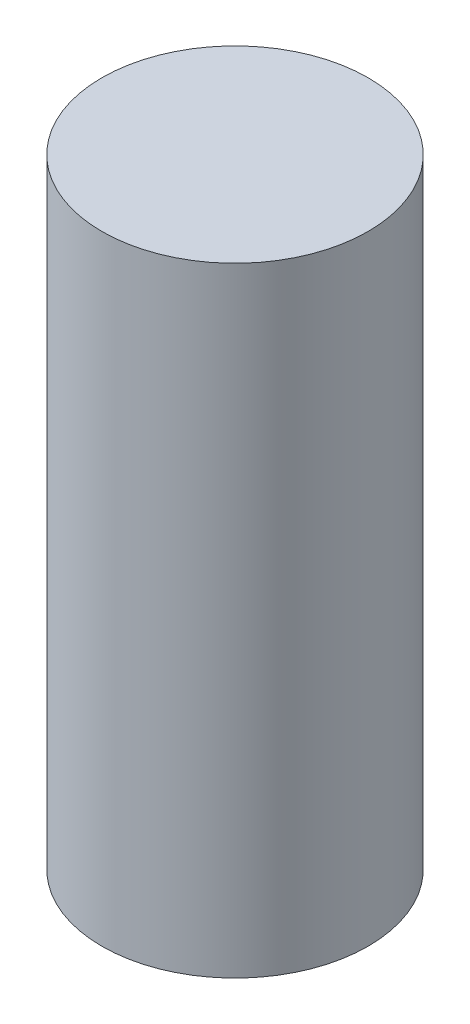
ISO-10303-21;
HEADER;
FILE_DESCRIPTION(('STEP AP214'),'2;1');
FILE_NAME('part.step','',(''),(''),'','','');
FILE_SCHEMA(('AUTOMOTIVE_DESIGN { 1 0 10303 214 1 1 1 1 }'));
ENDSEC;
DATA;
#1=APPLICATION_CONTEXT('core data for automotive mechanical design processes');
#2=APPLICATION_PROTOCOL_DEFINITION('international standard','automotive_design',2000,#1);
#3=PRODUCT_CONTEXT('',#1,'mechanical');
#4=PRODUCT('Part','Part','',(#3));
#5=PRODUCT_RELATED_PRODUCT_CATEGORY('part','',(#4));
#6=PRODUCT_DEFINITION_FORMATION('','',#4);
#7=PRODUCT_DEFINITION_CONTEXT('part definition',#1,'design');
#8=PRODUCT_DEFINITION('design','',#6,#7);
#9=PRODUCT_DEFINITION_SHAPE('','',#8);
#10=(LENGTH_UNIT() NAMED_UNIT(*) SI_UNIT(.MILLI.,.METRE.));
#11=(NAMED_UNIT(*) PLANE_ANGLE_UNIT() SI_UNIT($,.RADIAN.));
#12=(NAMED_UNIT(*) SI_UNIT($,.STERADIAN.) SOLID_ANGLE_UNIT());
#13=UNCERTAINTY_MEASURE_WITH_UNIT(LENGTH_MEASURE(1.E-05),#10,'distance_accuracy_value','');
#14=(GEOMETRIC_REPRESENTATION_CONTEXT(3) GLOBAL_UNCERTAINTY_ASSIGNED_CONTEXT((#13)) GLOBAL_UNIT_ASSIGNED_CONTEXT((#10,
#11,#12)) REPRESENTATION_CONTEXT('',''));
#15=CARTESIAN_POINT('',(0.,0.,0.));
#16=DIRECTION('',(0.,0.,1.));
#17=DIRECTION('',(1.,0.,0.));
#18=AXIS2_PLACEMENT_3D('',#15,#16,#17);
#19=CARTESIAN_POINT('',(-13.4853615461327,150.,-9.78349759229237));
#20=DIRECTION('',(0.,-1.,0.));
#21=DIRECTION('',(0.,0.,-1.));
#22=AXIS2_PLACEMENT_3D('',#19,#20,#21);
#23=CYLINDRICAL_SURFACE('',#22,32.2591001691802);
#24=CARTESIAN_POINT('',(-13.4853615461327,150.,-9.78349759229237));
#25=DIRECTION('',(0.,1.,0.));
#26=DIRECTION('',(0.,0.,1.));
#27=AXIS2_PLACEMENT_3D('',#24,#25,#26);
#28=CIRCLE('',#27,32.2591001691802);
#29=CARTESIAN_POINT('',(-13.4853615461327,150.,22.4756025768878));
#30=VERTEX_POINT('',#29);
#31=EDGE_CURVE('E10',#30,#30,#28,.T.);
#32=ORIENTED_EDGE('',*,*,#31,.F.);
#33=EDGE_LOOP('',(#32));
#34=FACE_BOUND('',#33,.T.);
#35=CARTESIAN_POINT('',(-13.4853615461327,0.,-9.78349759229237));
#36=DIRECTION('',(0.,1.,0.));
#37=DIRECTION('',(0.,0.,1.));
#38=AXIS2_PLACEMENT_3D('',#35,#36,#37);
#39=CIRCLE('',#38,32.2591001691802);
#40=CARTESIAN_POINT('',(-13.4853615461327,0.,22.4756025768878));
#41=VERTEX_POINT('',#40);
#42=EDGE_CURVE('E37',#41,#41,#39,.T.);
#43=ORIENTED_EDGE('',*,*,#42,.T.);
#44=EDGE_LOOP('',(#43));
#45=FACE_BOUND('',#44,.T.);
#46=ADVANCED_FACE('F40',(#34,#45),#23,.T.);
#47=CARTESIAN_POINT('',(-13.4853615461327,150.,-9.78349759229237));
#48=DIRECTION('',(0.,1.,0.));
#49=DIRECTION('',(0.,0.,1.));
#50=AXIS2_PLACEMENT_3D('',#47,#48,#49);
#51=PLANE('',#50);
#52=ORIENTED_EDGE('',*,*,#31,.T.);
#53=EDGE_LOOP('',(#52));
#54=FACE_BOUND('',#53,.T.);
#55=ADVANCED_FACE('F55',(#54),#51,.T.);
#56=CARTESIAN_POINT('',(-13.4853615461327,0.,-9.78349759229237));
#57=DIRECTION('',(0.,1.,0.));
#58=DIRECTION('',(0.,0.,1.));
#59=AXIS2_PLACEMENT_3D('',#56,#57,#58);
#60=PLANE('',#59);
#61=ORIENTED_EDGE('',*,*,#42,.F.);
#62=EDGE_LOOP('',(#61));
#63=FACE_BOUND('',#62,.T.);
#64=ADVANCED_FACE('F49',(#63),#60,.F.);
#65=CLOSED_SHELL('',(#46,#55,#64));
#66=MANIFOLD_SOLID_BREP('B2',#65);
#67=ADVANCED_BREP_SHAPE_REPRESENTATION('',(#18,#66),#14);
#68=SHAPE_DEFINITION_REPRESENTATION(#9,#67);
ENDSEC;
END-ISO-10303-21;
